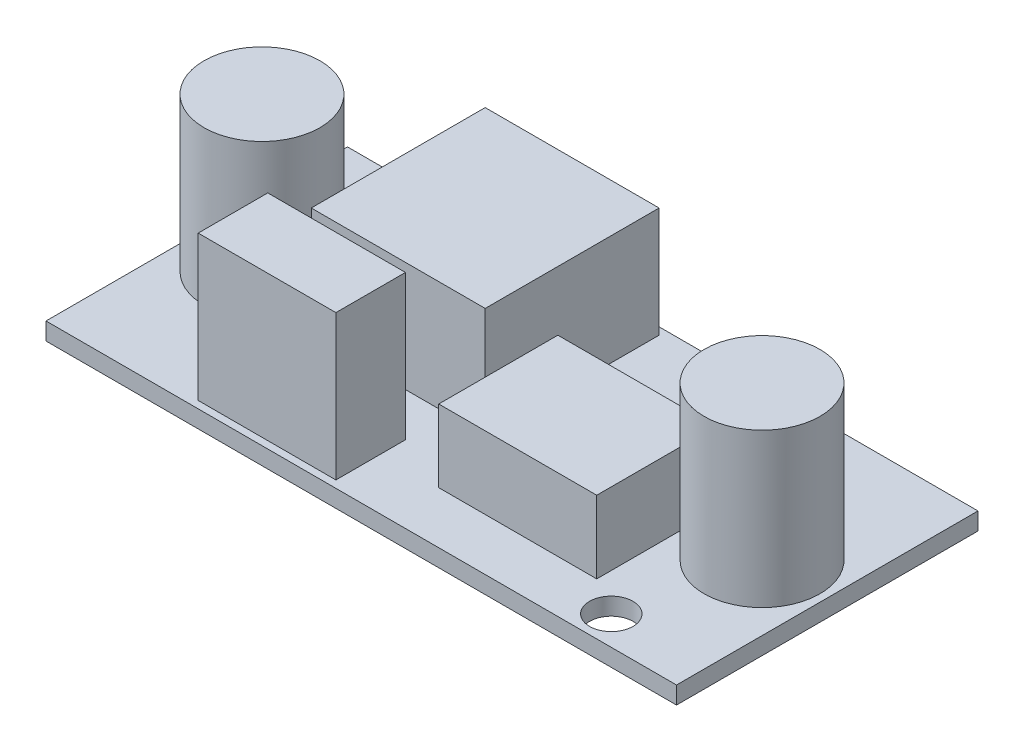
ISO-10303-21;
HEADER;
FILE_DESCRIPTION(('STEP AP214'),'2;1');
FILE_NAME('part.step','',(''),(''),'','','');
FILE_SCHEMA(('AUTOMOTIVE_DESIGN { 1 0 10303 214 1 1 1 1 }'));
ENDSEC;
DATA;
#1=APPLICATION_CONTEXT('core data for automotive mechanical design processes');
#2=APPLICATION_PROTOCOL_DEFINITION('international standard','automotive_design',2000,#1);
#3=PRODUCT_CONTEXT('',#1,'mechanical');
#4=PRODUCT('Part','Part','',(#3));
#5=PRODUCT_RELATED_PRODUCT_CATEGORY('part','',(#4));
#6=PRODUCT_DEFINITION_FORMATION('','',#4);
#7=PRODUCT_DEFINITION_CONTEXT('part definition',#1,'design');
#8=PRODUCT_DEFINITION('design','',#6,#7);
#9=PRODUCT_DEFINITION_SHAPE('','',#8);
#10=(LENGTH_UNIT() NAMED_UNIT(*) SI_UNIT(.MILLI.,.METRE.));
#11=(NAMED_UNIT(*) PLANE_ANGLE_UNIT() SI_UNIT($,.RADIAN.));
#12=(NAMED_UNIT(*) SI_UNIT($,.STERADIAN.) SOLID_ANGLE_UNIT());
#13=UNCERTAINTY_MEASURE_WITH_UNIT(LENGTH_MEASURE(1.E-05),#10,'distance_accuracy_value','');
#14=(GEOMETRIC_REPRESENTATION_CONTEXT(3) GLOBAL_UNCERTAINTY_ASSIGNED_CONTEXT((#13)) GLOBAL_UNIT_ASSIGNED_CONTEXT((#10,
#11,#12)) REPRESENTATION_CONTEXT('',''));
#15=CARTESIAN_POINT('',(0.,0.,0.));
#16=DIRECTION('',(0.,0.,1.));
#17=DIRECTION('',(1.,0.,0.));
#18=AXIS2_PLACEMENT_3D('',#15,#16,#17);
#19=CARTESIAN_POINT('',(0.,1.2,0.));
#20=DIRECTION('',(0.,-1.,0.));
#21=DIRECTION('',(0.,0.,-1.));
#22=AXIS2_PLACEMENT_3D('',#19,#20,#21);
#23=PLANE('',#22);
#24=CARTESIAN_POINT('',(15.25,1.2,8.4));
#25=DIRECTION('',(0.,1.,0.));
#26=DIRECTION('',(0.,0.,1.));
#27=AXIS2_PLACEMENT_3D('',#24,#25,#26);
#28=CIRCLE('',#27,1.5);
#29=CARTESIAN_POINT('',(15.25,1.2,9.9));
#30=VERTEX_POINT('',#29);
#31=EDGE_CURVE('E330',#30,#30,#28,.T.);
#32=ORIENTED_EDGE('',*,*,#31,.F.);
#33=EDGE_LOOP('',(#32));
#34=FACE_BOUND('',#33,.T.);
#35=CARTESIAN_POINT('',(-15.25,1.2,-8.4));
#36=DIRECTION('',(0.,1.,0.));
#37=DIRECTION('',(0.,0.,1.));
#38=AXIS2_PLACEMENT_3D('',#35,#36,#37);
#39=CIRCLE('',#38,1.5);
#40=CARTESIAN_POINT('',(-15.25,1.2,-6.9));
#41=VERTEX_POINT('',#40);
#42=EDGE_CURVE('E337',#41,#41,#39,.T.);
#43=ORIENTED_EDGE('',*,*,#42,.F.);
#44=EDGE_LOOP('',(#43));
#45=FACE_BOUND('',#44,.T.);
#46=DIRECTION('',(0.,0.,1.));
#47=VECTOR('',#46,1.);
#48=CARTESIAN_POINT('',(-11.75,1.2,5.1));
#49=LINE('',#48,#47);
#50=CARTESIAN_POINT('',(-11.75,1.2,5.1));
#51=VERTEX_POINT('',#50);
#52=CARTESIAN_POINT('',(-11.75,1.2,9.9));
#53=VERTEX_POINT('',#52);
#54=EDGE_CURVE('E179',#51,#53,#49,.T.);
#55=ORIENTED_EDGE('',*,*,#54,.F.);
#56=DIRECTION('',(-1.,0.,0.));
#57=VECTOR('',#56,1.);
#58=CARTESIAN_POINT('',(-11.75,1.2,5.1));
#59=LINE('',#58,#57);
#60=CARTESIAN_POINT('',(-2.25,1.2,5.1));
#61=VERTEX_POINT('',#60);
#62=EDGE_CURVE('E195',#61,#51,#59,.T.);
#63=ORIENTED_EDGE('',*,*,#62,.F.);
#64=DIRECTION('',(0.,0.,-1.));
#65=VECTOR('',#64,1.);
#66=CARTESIAN_POINT('',(-2.25,1.2,5.1));
#67=LINE('',#66,#65);
#68=CARTESIAN_POINT('',(-2.25,1.2,9.9));
#69=VERTEX_POINT('',#68);
#70=EDGE_CURVE('E208',#69,#61,#67,.T.);
#71=ORIENTED_EDGE('',*,*,#70,.F.);
#72=DIRECTION('',(1.,0.,0.));
#73=VECTOR('',#72,1.);
#74=CARTESIAN_POINT('',(-11.75,1.2,9.9));
#75=LINE('',#74,#73);
#76=EDGE_CURVE('E184',#53,#69,#75,.T.);
#77=ORIENTED_EDGE('',*,*,#76,.F.);
#78=EDGE_LOOP('',(#55,#63,#71,#77));
#79=FACE_BOUND('',#78,.T.);
#80=CARTESIAN_POINT('',(17.25,1.2,0.));
#81=DIRECTION('',(0.,-1.,0.));
#82=DIRECTION('',(0.,0.,-1.));
#83=AXIS2_PLACEMENT_3D('',#80,#81,#82);
#84=CIRCLE('',#83,4.);
#85=CARTESIAN_POINT('',(17.25,1.2,-4.));
#86=VERTEX_POINT('',#85);
#87=EDGE_CURVE('E11',#86,#86,#84,.F.);
#88=ORIENTED_EDGE('',*,*,#87,.F.);
#89=EDGE_LOOP('',(#88));
#90=FACE_BOUND('',#89,.T.);
#91=CARTESIAN_POINT('',(-17.25,1.2,0.));
#92=DIRECTION('',(0.,-1.,0.));
#93=DIRECTION('',(0.,0.,-1.));
#94=AXIS2_PLACEMENT_3D('',#91,#92,#93);
#95=CIRCLE('',#94,4.);
#96=CARTESIAN_POINT('',(-17.25,1.2,-4.));
#97=VERTEX_POINT('',#96);
#98=EDGE_CURVE('E49',#97,#97,#95,.F.);
#99=ORIENTED_EDGE('',*,*,#98,.F.);
#100=EDGE_LOOP('',(#99));
#101=FACE_BOUND('',#100,.T.);
#102=DIRECTION('',(0.,0.,-1.));
#103=VECTOR('',#102,1.);
#104=CARTESIAN_POINT('',(21.75,1.2,10.4));
#105=LINE('',#104,#103);
#106=CARTESIAN_POINT('',(21.75,1.2,10.4));
#107=VERTEX_POINT('',#106);
#108=CARTESIAN_POINT('',(21.75,1.2,-10.4));
#109=VERTEX_POINT('',#108);
#110=EDGE_CURVE('E284',#107,#109,#105,.T.);
#111=ORIENTED_EDGE('',*,*,#110,.T.);
#112=DIRECTION('',(-1.,0.,0.));
#113=VECTOR('',#112,1.);
#114=CARTESIAN_POINT('',(-21.75,1.2,-10.4));
#115=LINE('',#114,#113);
#116=CARTESIAN_POINT('',(-21.75,1.2,-10.4));
#117=VERTEX_POINT('',#116);
#118=EDGE_CURVE('E288',#109,#117,#115,.T.);
#119=ORIENTED_EDGE('',*,*,#118,.T.);
#120=DIRECTION('',(0.,0.,1.));
#121=VECTOR('',#120,1.);
#122=CARTESIAN_POINT('',(-21.75,1.2,10.4));
#123=LINE('',#122,#121);
#124=CARTESIAN_POINT('',(-21.75,1.2,10.4));
#125=VERTEX_POINT('',#124);
#126=EDGE_CURVE('E292',#117,#125,#123,.T.);
#127=ORIENTED_EDGE('',*,*,#126,.T.);
#128=DIRECTION('',(1.,0.,0.));
#129=VECTOR('',#128,1.);
#130=CARTESIAN_POINT('',(-21.75,1.2,10.4));
#131=LINE('',#130,#129);
#132=EDGE_CURVE('E295',#125,#107,#131,.T.);
#133=ORIENTED_EDGE('',*,*,#132,.T.);
#134=EDGE_LOOP('',(#111,#119,#127,#133));
#135=FACE_BOUND('',#134,.T.);
#136=DIRECTION('',(0.,0.,1.));
#137=VECTOR('',#136,1.);
#138=CARTESIAN_POINT('',(-11.75,1.2,-9.9));
#139=LINE('',#138,#137);
#140=CARTESIAN_POINT('',(-11.75,1.2,-9.9));
#141=VERTEX_POINT('',#140);
#142=CARTESIAN_POINT('',(-11.75,1.2,2.1));
#143=VERTEX_POINT('',#142);
#144=EDGE_CURVE('E238',#141,#143,#139,.T.);
#145=ORIENTED_EDGE('',*,*,#144,.F.);
#146=DIRECTION('',(-1.,0.,0.));
#147=VECTOR('',#146,1.);
#148=CARTESIAN_POINT('',(-11.75,1.2,-9.9));
#149=LINE('',#148,#147);
#150=CARTESIAN_POINT('',(0.249999999999999,1.2,-9.9));
#151=VERTEX_POINT('',#150);
#152=EDGE_CURVE('E244',#151,#141,#149,.T.);
#153=ORIENTED_EDGE('',*,*,#152,.F.);
#154=DIRECTION('',(0.,0.,-1.));
#155=VECTOR('',#154,1.);
#156=CARTESIAN_POINT('',(0.249999999999999,1.2,-9.9));
#157=LINE('',#156,#155);
#158=CARTESIAN_POINT('',(0.25,1.2,2.1));
#159=VERTEX_POINT('',#158);
#160=EDGE_CURVE('E261',#159,#151,#157,.T.);
#161=ORIENTED_EDGE('',*,*,#160,.F.);
#162=DIRECTION('',(1.,0.,0.));
#163=VECTOR('',#162,1.);
#164=CARTESIAN_POINT('',(-11.75,1.2,2.1));
#165=LINE('',#164,#163);
#166=EDGE_CURVE('E257',#143,#159,#165,.T.);
#167=ORIENTED_EDGE('',*,*,#166,.F.);
#168=EDGE_LOOP('',(#145,#153,#161,#167));
#169=FACE_BOUND('',#168,.T.);
#170=DIRECTION('',(0.,0.,1.));
#171=VECTOR('',#170,1.);
#172=CARTESIAN_POINT('',(1.75825449552439,1.2,-1.40660359641949));
#173=LINE('',#172,#171);
#174=CARTESIAN_POINT('',(1.75825449552439,1.2,-1.40660359641949));
#175=VERTEX_POINT('',#174);
#176=CARTESIAN_POINT('',(1.75825449552439,1.2,6.81323617015706));
#177=VERTEX_POINT('',#176);
#178=EDGE_CURVE('E177',#175,#177,#173,.T.);
#179=ORIENTED_EDGE('',*,*,#178,.F.);
#180=DIRECTION('',(-1.,0.,0.));
#181=VECTOR('',#180,1.);
#182=CARTESIAN_POINT('',(1.75825449552439,1.2,-1.40660359641949));
#183=LINE('',#182,#181);
#184=CARTESIAN_POINT('',(12.6594323677757,1.2,-1.40660359641949));
#185=VERTEX_POINT('',#184);
#186=EDGE_CURVE('E174',#185,#175,#183,.T.);
#187=ORIENTED_EDGE('',*,*,#186,.F.);
#188=DIRECTION('',(0.,0.,-1.));
#189=VECTOR('',#188,1.);
#190=CARTESIAN_POINT('',(12.6594323677757,1.2,-1.40660359641949));
#191=LINE('',#190,#189);
#192=CARTESIAN_POINT('',(12.6594323677757,1.2,6.81323617015706));
#193=VERTEX_POINT('',#192);
#194=EDGE_CURVE('E62',#193,#185,#191,.T.);
#195=ORIENTED_EDGE('',*,*,#194,.F.);
#196=DIRECTION('',(1.,0.,0.));
#197=VECTOR('',#196,1.);
#198=CARTESIAN_POINT('',(1.75825449552439,1.2,6.81323617015706));
#199=LINE('',#198,#197);
#200=EDGE_CURVE('E57',#177,#193,#199,.T.);
#201=ORIENTED_EDGE('',*,*,#200,.F.);
#202=EDGE_LOOP('',(#179,#187,#195,#201));
#203=FACE_BOUND('',#202,.T.);
#204=ADVANCED_FACE('F39',(#34,#45,#79,#90,#101,#135,#169,#203),#23,.F.);
#205=CARTESIAN_POINT('',(21.75,1.2,10.4));
#206=DIRECTION('',(-1.,0.,0.));
#207=DIRECTION('',(0.,0.,1.));
#208=AXIS2_PLACEMENT_3D('',#205,#206,#207);
#209=PLANE('',#208);
#210=DIRECTION('',(0.,0.,-1.));
#211=VECTOR('',#210,1.);
#212=CARTESIAN_POINT('',(21.75,0.,10.4));
#213=LINE('',#212,#211);
#214=CARTESIAN_POINT('',(21.75,0.,10.4));
#215=VERTEX_POINT('',#214);
#216=CARTESIAN_POINT('',(21.75,0.,-10.4));
#217=VERTEX_POINT('',#216);
#218=EDGE_CURVE('E283',#215,#217,#213,.T.);
#219=ORIENTED_EDGE('',*,*,#218,.T.);
#220=DIRECTION('',(0.,-1.,0.));
#221=VECTOR('',#220,1.);
#222=CARTESIAN_POINT('',(21.75,1.2,-10.4));
#223=LINE('',#222,#221);
#224=EDGE_CURVE('E321',#109,#217,#223,.T.);
#225=ORIENTED_EDGE('',*,*,#224,.F.);
#226=ORIENTED_EDGE('',*,*,#110,.F.);
#227=DIRECTION('',(0.,-1.,0.));
#228=VECTOR('',#227,1.);
#229=CARTESIAN_POINT('',(21.75,1.2,10.4));
#230=LINE('',#229,#228);
#231=EDGE_CURVE('E298',#107,#215,#230,.T.);
#232=ORIENTED_EDGE('',*,*,#231,.T.);
#233=EDGE_LOOP('',(#219,#225,#226,#232));
#234=FACE_BOUND('',#233,.T.);
#235=ADVANCED_FACE('F41',(#234),#209,.F.);
#236=CARTESIAN_POINT('',(-21.75,1.2,-10.4));
#237=DIRECTION('',(0.,0.,1.));
#238=DIRECTION('',(1.,0.,0.));
#239=AXIS2_PLACEMENT_3D('',#236,#237,#238);
#240=PLANE('',#239);
#241=DIRECTION('',(-1.,0.,0.));
#242=VECTOR('',#241,1.);
#243=CARTESIAN_POINT('',(-21.75,0.,-10.4));
#244=LINE('',#243,#242);
#245=CARTESIAN_POINT('',(-21.75,0.,-10.4));
#246=VERTEX_POINT('',#245);
#247=EDGE_CURVE('E302',#217,#246,#244,.T.);
#248=ORIENTED_EDGE('',*,*,#247,.T.);
#249=DIRECTION('',(0.,-1.,0.));
#250=VECTOR('',#249,1.);
#251=CARTESIAN_POINT('',(-21.75,1.2,-10.4));
#252=LINE('',#251,#250);
#253=EDGE_CURVE('E317',#117,#246,#252,.T.);
#254=ORIENTED_EDGE('',*,*,#253,.F.);
#255=ORIENTED_EDGE('',*,*,#118,.F.);
#256=ORIENTED_EDGE('',*,*,#224,.T.);
#257=EDGE_LOOP('',(#248,#254,#255,#256));
#258=FACE_BOUND('',#257,.T.);
#259=ADVANCED_FACE('F381',(#258),#240,.F.);
#260=CARTESIAN_POINT('',(-21.75,1.2,10.4));
#261=DIRECTION('',(1.,0.,0.));
#262=DIRECTION('',(0.,0.,-1.));
#263=AXIS2_PLACEMENT_3D('',#260,#261,#262);
#264=PLANE('',#263);
#265=DIRECTION('',(0.,0.,1.));
#266=VECTOR('',#265,1.);
#267=CARTESIAN_POINT('',(-21.75,0.,10.4));
#268=LINE('',#267,#266);
#269=CARTESIAN_POINT('',(-21.75,0.,10.4));
#270=VERTEX_POINT('',#269);
#271=EDGE_CURVE('E305',#246,#270,#268,.T.);
#272=ORIENTED_EDGE('',*,*,#271,.T.);
#273=DIRECTION('',(0.,-1.,0.));
#274=VECTOR('',#273,1.);
#275=CARTESIAN_POINT('',(-21.75,1.2,10.4));
#276=LINE('',#275,#274);
#277=EDGE_CURVE('E313',#125,#270,#276,.T.);
#278=ORIENTED_EDGE('',*,*,#277,.F.);
#279=ORIENTED_EDGE('',*,*,#126,.F.);
#280=ORIENTED_EDGE('',*,*,#253,.T.);
#281=EDGE_LOOP('',(#272,#278,#279,#280));
#282=FACE_BOUND('',#281,.T.);
#283=ADVANCED_FACE('F395',(#282),#264,.F.);
#284=CARTESIAN_POINT('',(-21.75,1.2,10.4));
#285=DIRECTION('',(0.,0.,-1.));
#286=DIRECTION('',(-1.,0.,0.));
#287=AXIS2_PLACEMENT_3D('',#284,#285,#286);
#288=PLANE('',#287);
#289=DIRECTION('',(1.,0.,0.));
#290=VECTOR('',#289,1.);
#291=CARTESIAN_POINT('',(-21.75,0.,10.4));
#292=LINE('',#291,#290);
#293=EDGE_CURVE('E289',#270,#215,#292,.T.);
#294=ORIENTED_EDGE('',*,*,#293,.T.);
#295=ORIENTED_EDGE('',*,*,#231,.F.);
#296=ORIENTED_EDGE('',*,*,#132,.F.);
#297=ORIENTED_EDGE('',*,*,#277,.T.);
#298=EDGE_LOOP('',(#294,#295,#296,#297));
#299=FACE_BOUND('',#298,.T.);
#300=ADVANCED_FACE('F391',(#299),#288,.F.);
#301=CARTESIAN_POINT('',(0.,0.,0.));
#302=DIRECTION('',(0.,-1.,0.));
#303=DIRECTION('',(0.,0.,-1.));
#304=AXIS2_PLACEMENT_3D('',#301,#302,#303);
#305=PLANE('',#304);
#306=CARTESIAN_POINT('',(15.25,0.,8.4));
#307=DIRECTION('',(0.,-1.,0.));
#308=DIRECTION('',(0.,0.,-1.));
#309=AXIS2_PLACEMENT_3D('',#306,#307,#308);
#310=CIRCLE('',#309,1.5);
#311=CARTESIAN_POINT('',(15.25,0.,6.9));
#312=VERTEX_POINT('',#311);
#313=EDGE_CURVE('E43',#312,#312,#310,.T.);
#314=ORIENTED_EDGE('',*,*,#313,.F.);
#315=EDGE_LOOP('',(#314));
#316=FACE_BOUND('',#315,.T.);
#317=CARTESIAN_POINT('',(-15.25,0.,-8.4));
#318=DIRECTION('',(0.,-1.,0.));
#319=DIRECTION('',(0.,0.,-1.));
#320=AXIS2_PLACEMENT_3D('',#317,#318,#319);
#321=CIRCLE('',#320,1.5);
#322=CARTESIAN_POINT('',(-15.25,0.,-9.9));
#323=VERTEX_POINT('',#322);
#324=EDGE_CURVE('E327',#323,#323,#321,.T.);
#325=ORIENTED_EDGE('',*,*,#324,.F.);
#326=EDGE_LOOP('',(#325));
#327=FACE_BOUND('',#326,.T.);
#328=ORIENTED_EDGE('',*,*,#218,.F.);
#329=ORIENTED_EDGE('',*,*,#293,.F.);
#330=ORIENTED_EDGE('',*,*,#271,.F.);
#331=ORIENTED_EDGE('',*,*,#247,.F.);
#332=EDGE_LOOP('',(#328,#329,#330,#331));
#333=FACE_BOUND('',#332,.T.);
#334=ADVANCED_FACE('F388',(#316,#327,#333),#305,.T.);
#335=CARTESIAN_POINT('',(-11.75,8.8,-9.9));
#336=DIRECTION('',(1.,0.,0.));
#337=DIRECTION('',(0.,0.,-1.));
#338=AXIS2_PLACEMENT_3D('',#335,#336,#337);
#339=PLANE('',#338);
#340=ORIENTED_EDGE('',*,*,#144,.T.);
#341=DIRECTION('',(0.,-1.,0.));
#342=VECTOR('',#341,1.);
#343=CARTESIAN_POINT('',(-11.75,8.8,2.1));
#344=LINE('',#343,#342);
#345=CARTESIAN_POINT('',(-11.75,8.8,2.1));
#346=VERTEX_POINT('',#345);
#347=EDGE_CURVE('E279',#346,#143,#344,.T.);
#348=ORIENTED_EDGE('',*,*,#347,.F.);
#349=DIRECTION('',(0.,0.,1.));
#350=VECTOR('',#349,1.);
#351=CARTESIAN_POINT('',(-11.75,8.8,-9.9));
#352=LINE('',#351,#350);
#353=CARTESIAN_POINT('',(-11.75,8.8,-9.9));
#354=VERTEX_POINT('',#353);
#355=EDGE_CURVE('E239',#354,#346,#352,.T.);
#356=ORIENTED_EDGE('',*,*,#355,.F.);
#357=DIRECTION('',(0.,-1.,0.));
#358=VECTOR('',#357,1.);
#359=CARTESIAN_POINT('',(-11.75,8.8,-9.9));
#360=LINE('',#359,#358);
#361=EDGE_CURVE('E253',#354,#141,#360,.T.);
#362=ORIENTED_EDGE('',*,*,#361,.T.);
#363=EDGE_LOOP('',(#340,#348,#356,#362));
#364=FACE_BOUND('',#363,.T.);
#365=ADVANCED_FACE('F386',(#364),#339,.F.);
#366=CARTESIAN_POINT('',(-11.75,8.8,2.1));
#367=DIRECTION('',(0.,0.,-1.));
#368=DIRECTION('',(-1.,0.,0.));
#369=AXIS2_PLACEMENT_3D('',#366,#367,#368);
#370=PLANE('',#369);
#371=ORIENTED_EDGE('',*,*,#166,.T.);
#372=DIRECTION('',(0.,-1.,0.));
#373=VECTOR('',#372,1.);
#374=CARTESIAN_POINT('',(0.25,8.8,2.1));
#375=LINE('',#374,#373);
#376=CARTESIAN_POINT('',(0.25,8.8,2.1));
#377=VERTEX_POINT('',#376);
#378=EDGE_CURVE('E275',#377,#159,#375,.T.);
#379=ORIENTED_EDGE('',*,*,#378,.F.);
#380=DIRECTION('',(1.,0.,0.));
#381=VECTOR('',#380,1.);
#382=CARTESIAN_POINT('',(-11.75,8.8,2.1));
#383=LINE('',#382,#381);
#384=EDGE_CURVE('E243',#346,#377,#383,.T.);
#385=ORIENTED_EDGE('',*,*,#384,.F.);
#386=ORIENTED_EDGE('',*,*,#347,.T.);
#387=EDGE_LOOP('',(#371,#379,#385,#386));
#388=FACE_BOUND('',#387,.T.);
#389=ADVANCED_FACE('F431',(#388),#370,.F.);
#390=CARTESIAN_POINT('',(0.249999999999999,8.8,-9.9));
#391=DIRECTION('',(-1.,0.,0.));
#392=DIRECTION('',(0.,0.,1.));
#393=AXIS2_PLACEMENT_3D('',#390,#391,#392);
#394=PLANE('',#393);
#395=ORIENTED_EDGE('',*,*,#160,.T.);
#396=DIRECTION('',(0.,-1.,0.));
#397=VECTOR('',#396,1.);
#398=CARTESIAN_POINT('',(0.249999999999999,8.8,-9.9));
#399=LINE('',#398,#397);
#400=CARTESIAN_POINT('',(0.249999999999999,8.8,-9.9));
#401=VERTEX_POINT('',#400);
#402=EDGE_CURVE('E271',#401,#151,#399,.T.);
#403=ORIENTED_EDGE('',*,*,#402,.F.);
#404=DIRECTION('',(0.,0.,-1.));
#405=VECTOR('',#404,1.);
#406=CARTESIAN_POINT('',(0.249999999999999,8.8,-9.9));
#407=LINE('',#406,#405);
#408=EDGE_CURVE('E247',#377,#401,#407,.T.);
#409=ORIENTED_EDGE('',*,*,#408,.F.);
#410=ORIENTED_EDGE('',*,*,#378,.T.);
#411=EDGE_LOOP('',(#395,#403,#409,#410));
#412=FACE_BOUND('',#411,.T.);
#413=ADVANCED_FACE('F429',(#412),#394,.F.);
#414=CARTESIAN_POINT('',(-11.75,8.8,-9.9));
#415=DIRECTION('',(0.,0.,1.));
#416=DIRECTION('',(1.,0.,0.));
#417=AXIS2_PLACEMENT_3D('',#414,#415,#416);
#418=PLANE('',#417);
#419=ORIENTED_EDGE('',*,*,#152,.T.);
#420=ORIENTED_EDGE('',*,*,#361,.F.);
#421=DIRECTION('',(-1.,0.,0.));
#422=VECTOR('',#421,1.);
#423=CARTESIAN_POINT('',(-11.75,8.8,-9.9));
#424=LINE('',#423,#422);
#425=EDGE_CURVE('E250',#401,#354,#424,.T.);
#426=ORIENTED_EDGE('',*,*,#425,.F.);
#427=ORIENTED_EDGE('',*,*,#402,.T.);
#428=EDGE_LOOP('',(#419,#420,#426,#427));
#429=FACE_BOUND('',#428,.T.);
#430=ADVANCED_FACE('F420',(#429),#418,.F.);
#431=CARTESIAN_POINT('',(0.,8.8,0.));
#432=DIRECTION('',(0.,1.,0.));
#433=DIRECTION('',(0.,0.,1.));
#434=AXIS2_PLACEMENT_3D('',#431,#432,#433);
#435=PLANE('',#434);
#436=ORIENTED_EDGE('',*,*,#355,.T.);
#437=ORIENTED_EDGE('',*,*,#384,.T.);
#438=ORIENTED_EDGE('',*,*,#408,.T.);
#439=ORIENTED_EDGE('',*,*,#425,.T.);
#440=EDGE_LOOP('',(#436,#437,#438,#439));
#441=FACE_BOUND('',#440,.T.);
#442=ADVANCED_FACE('F425',(#441),#435,.T.);
#443=CARTESIAN_POINT('',(-17.25,11.8,0.));
#444=DIRECTION('',(0.,-1.,0.));
#445=DIRECTION('',(0.,0.,-1.));
#446=AXIS2_PLACEMENT_3D('',#443,#444,#445);
#447=CYLINDRICAL_SURFACE('',#446,4.);
#448=CARTESIAN_POINT('',(-17.25,11.8,0.));
#449=DIRECTION('',(0.,1.,0.));
#450=DIRECTION('',(0.,0.,1.));
#451=AXIS2_PLACEMENT_3D('',#448,#449,#450);
#452=CIRCLE('',#451,4.);
#453=CARTESIAN_POINT('',(-17.25,11.8,4.));
#454=VERTEX_POINT('',#453);
#455=EDGE_CURVE('E234',#454,#454,#452,.T.);
#456=ORIENTED_EDGE('',*,*,#455,.F.);
#457=EDGE_LOOP('',(#456));
#458=FACE_BOUND('',#457,.T.);
#459=ORIENTED_EDGE('',*,*,#98,.T.);
#460=EDGE_LOOP('',(#459));
#461=FACE_BOUND('',#460,.T.);
#462=ADVANCED_FACE('F443',(#458,#461),#447,.T.);
#463=CARTESIAN_POINT('',(-17.25,11.8,0.));
#464=DIRECTION('',(0.,1.,0.));
#465=DIRECTION('',(0.,0.,1.));
#466=AXIS2_PLACEMENT_3D('',#463,#464,#465);
#467=PLANE('',#466);
#468=ORIENTED_EDGE('',*,*,#455,.T.);
#469=EDGE_LOOP('',(#468));
#470=FACE_BOUND('',#469,.T.);
#471=ADVANCED_FACE('F446',(#470),#467,.T.);
#472=CARTESIAN_POINT('',(17.25,11.8,0.));
#473=DIRECTION('',(0.,-1.,0.));
#474=DIRECTION('',(0.,0.,-1.));
#475=AXIS2_PLACEMENT_3D('',#472,#473,#474);
#476=CYLINDRICAL_SURFACE('',#475,4.);
#477=CARTESIAN_POINT('',(17.25,11.8,0.));
#478=DIRECTION('',(0.,1.,0.));
#479=DIRECTION('',(0.,0.,1.));
#480=AXIS2_PLACEMENT_3D('',#477,#478,#479);
#481=CIRCLE('',#480,4.);
#482=CARTESIAN_POINT('',(17.25,11.8,4.));
#483=VERTEX_POINT('',#482);
#484=EDGE_CURVE('E230',#483,#483,#481,.T.);
#485=ORIENTED_EDGE('',*,*,#484,.F.);
#486=EDGE_LOOP('',(#485));
#487=FACE_BOUND('',#486,.T.);
#488=ORIENTED_EDGE('',*,*,#87,.T.);
#489=EDGE_LOOP('',(#488));
#490=FACE_BOUND('',#489,.T.);
#491=ADVANCED_FACE('F450',(#487,#490),#476,.T.);
#492=CARTESIAN_POINT('',(17.25,11.8,0.));
#493=DIRECTION('',(0.,1.,0.));
#494=DIRECTION('',(0.,0.,1.));
#495=AXIS2_PLACEMENT_3D('',#492,#493,#494);
#496=PLANE('',#495);
#497=ORIENTED_EDGE('',*,*,#484,.T.);
#498=EDGE_LOOP('',(#497));
#499=FACE_BOUND('',#498,.T.);
#500=ADVANCED_FACE('F454',(#499),#496,.T.);
#501=CARTESIAN_POINT('',(-11.75,11.2,5.1));
#502=DIRECTION('',(1.,0.,0.));
#503=DIRECTION('',(0.,0.,-1.));
#504=AXIS2_PLACEMENT_3D('',#501,#502,#503);
#505=PLANE('',#504);
#506=ORIENTED_EDGE('',*,*,#54,.T.);
#507=DIRECTION('',(0.,-1.,0.));
#508=VECTOR('',#507,1.);
#509=CARTESIAN_POINT('',(-11.75,11.2,9.9));
#510=LINE('',#509,#508);
#511=CARTESIAN_POINT('',(-11.75,11.2,9.9));
#512=VERTEX_POINT('',#511);
#513=EDGE_CURVE('E226',#512,#53,#510,.T.);
#514=ORIENTED_EDGE('',*,*,#513,.F.);
#515=DIRECTION('',(0.,0.,1.));
#516=VECTOR('',#515,1.);
#517=CARTESIAN_POINT('',(-11.75,11.2,5.1));
#518=LINE('',#517,#516);
#519=CARTESIAN_POINT('',(-11.75,11.2,5.1));
#520=VERTEX_POINT('',#519);
#521=EDGE_CURVE('E190',#520,#512,#518,.T.);
#522=ORIENTED_EDGE('',*,*,#521,.F.);
#523=DIRECTION('',(0.,-1.,0.));
#524=VECTOR('',#523,1.);
#525=CARTESIAN_POINT('',(-11.75,11.2,5.1));
#526=LINE('',#525,#524);
#527=EDGE_CURVE('E203',#520,#51,#526,.T.);
#528=ORIENTED_EDGE('',*,*,#527,.T.);
#529=EDGE_LOOP('',(#506,#514,#522,#528));
#530=FACE_BOUND('',#529,.T.);
#531=ADVANCED_FACE('F458',(#530),#505,.F.);
#532=CARTESIAN_POINT('',(-11.75,11.2,9.9));
#533=DIRECTION('',(0.,0.,-1.));
#534=DIRECTION('',(-1.,0.,0.));
#535=AXIS2_PLACEMENT_3D('',#532,#533,#534);
#536=PLANE('',#535);
#537=ORIENTED_EDGE('',*,*,#76,.T.);
#538=DIRECTION('',(0.,-1.,0.));
#539=VECTOR('',#538,1.);
#540=CARTESIAN_POINT('',(-2.25,11.2,9.9));
#541=LINE('',#540,#539);
#542=CARTESIAN_POINT('',(-2.25,11.2,9.9));
#543=VERTEX_POINT('',#542);
#544=EDGE_CURVE('E222',#543,#69,#541,.T.);
#545=ORIENTED_EDGE('',*,*,#544,.F.);
#546=DIRECTION('',(1.,0.,0.));
#547=VECTOR('',#546,1.);
#548=CARTESIAN_POINT('',(-11.75,11.2,9.9));
#549=LINE('',#548,#547);
#550=EDGE_CURVE('E194',#512,#543,#549,.T.);
#551=ORIENTED_EDGE('',*,*,#550,.F.);
#552=ORIENTED_EDGE('',*,*,#513,.T.);
#553=EDGE_LOOP('',(#537,#545,#551,#552));
#554=FACE_BOUND('',#553,.T.);
#555=ADVANCED_FACE('F462',(#554),#536,.F.);
#556=CARTESIAN_POINT('',(-2.25,11.2,5.1));
#557=DIRECTION('',(-1.,0.,0.));
#558=DIRECTION('',(0.,0.,1.));
#559=AXIS2_PLACEMENT_3D('',#556,#557,#558);
#560=PLANE('',#559);
#561=ORIENTED_EDGE('',*,*,#70,.T.);
#562=DIRECTION('',(0.,-1.,0.));
#563=VECTOR('',#562,1.);
#564=CARTESIAN_POINT('',(-2.25,11.2,5.1));
#565=LINE('',#564,#563);
#566=CARTESIAN_POINT('',(-2.25,11.2,5.1));
#567=VERTEX_POINT('',#566);
#568=EDGE_CURVE('E218',#567,#61,#565,.T.);
#569=ORIENTED_EDGE('',*,*,#568,.F.);
#570=DIRECTION('',(0.,0.,-1.));
#571=VECTOR('',#570,1.);
#572=CARTESIAN_POINT('',(-2.25,11.2,5.1));
#573=LINE('',#572,#571);
#574=EDGE_CURVE('E198',#543,#567,#573,.T.);
#575=ORIENTED_EDGE('',*,*,#574,.F.);
#576=ORIENTED_EDGE('',*,*,#544,.T.);
#577=EDGE_LOOP('',(#561,#569,#575,#576));
#578=FACE_BOUND('',#577,.T.);
#579=ADVANCED_FACE('F466',(#578),#560,.F.);
#580=CARTESIAN_POINT('',(-11.75,11.2,5.1));
#581=DIRECTION('',(0.,0.,1.));
#582=DIRECTION('',(1.,0.,0.));
#583=AXIS2_PLACEMENT_3D('',#580,#581,#582);
#584=PLANE('',#583);
#585=ORIENTED_EDGE('',*,*,#62,.T.);
#586=ORIENTED_EDGE('',*,*,#527,.F.);
#587=DIRECTION('',(-1.,0.,0.));
#588=VECTOR('',#587,1.);
#589=CARTESIAN_POINT('',(-11.75,11.2,5.1));
#590=LINE('',#589,#588);
#591=EDGE_CURVE('E201',#567,#520,#590,.T.);
#592=ORIENTED_EDGE('',*,*,#591,.F.);
#593=ORIENTED_EDGE('',*,*,#568,.T.);
#594=EDGE_LOOP('',(#585,#586,#592,#593));
#595=FACE_BOUND('',#594,.T.);
#596=ADVANCED_FACE('F470',(#595),#584,.F.);
#597=CARTESIAN_POINT('',(0.,11.2,0.));
#598=DIRECTION('',(0.,1.,0.));
#599=DIRECTION('',(0.,0.,1.));
#600=AXIS2_PLACEMENT_3D('',#597,#598,#599);
#601=PLANE('',#600);
#602=ORIENTED_EDGE('',*,*,#521,.T.);
#603=ORIENTED_EDGE('',*,*,#550,.T.);
#604=ORIENTED_EDGE('',*,*,#574,.T.);
#605=ORIENTED_EDGE('',*,*,#591,.T.);
#606=EDGE_LOOP('',(#602,#603,#604,#605));
#607=FACE_BOUND('',#606,.T.);
#608=ADVANCED_FACE('F474',(#607),#601,.T.);
#609=CARTESIAN_POINT('',(1.75825449552439,6.2,-1.40660359641949));
#610=DIRECTION('',(1.,0.,0.));
#611=DIRECTION('',(0.,0.,-1.));
#612=AXIS2_PLACEMENT_3D('',#609,#610,#611);
#613=PLANE('',#612);
#614=ORIENTED_EDGE('',*,*,#178,.T.);
#615=DIRECTION('',(0.,-1.,0.));
#616=VECTOR('',#615,1.);
#617=CARTESIAN_POINT('',(1.75825449552439,6.2,6.81323617015706));
#618=LINE('',#617,#616);
#619=CARTESIAN_POINT('',(1.75825449552439,6.2,6.81323617015706));
#620=VERTEX_POINT('',#619);
#621=EDGE_CURVE('E156',#620,#177,#618,.T.);
#622=ORIENTED_EDGE('',*,*,#621,.F.);
#623=DIRECTION('',(0.,0.,1.));
#624=VECTOR('',#623,1.);
#625=CARTESIAN_POINT('',(1.75825449552439,6.2,-1.40660359641949));
#626=LINE('',#625,#624);
#627=CARTESIAN_POINT('',(1.75825449552439,6.2,-1.40660359641949));
#628=VERTEX_POINT('',#627);
#629=EDGE_CURVE('E164',#628,#620,#626,.T.);
#630=ORIENTED_EDGE('',*,*,#629,.F.);
#631=DIRECTION('',(0.,-1.,0.));
#632=VECTOR('',#631,1.);
#633=CARTESIAN_POINT('',(1.75825449552439,6.2,-1.40660359641949));
#634=LINE('',#633,#632);
#635=EDGE_CURVE('E349',#628,#175,#634,.T.);
#636=ORIENTED_EDGE('',*,*,#635,.T.);
#637=EDGE_LOOP('',(#614,#622,#630,#636));
#638=FACE_BOUND('',#637,.T.);
#639=ADVANCED_FACE('F176',(#638),#613,.F.);
#640=CARTESIAN_POINT('',(1.75825449552439,6.2,6.81323617015706));
#641=DIRECTION('',(0.,0.,-1.));
#642=DIRECTION('',(-1.,0.,0.));
#643=AXIS2_PLACEMENT_3D('',#640,#641,#642);
#644=PLANE('',#643);
#645=ORIENTED_EDGE('',*,*,#200,.T.);
#646=DIRECTION('',(0.,-1.,0.));
#647=VECTOR('',#646,1.);
#648=CARTESIAN_POINT('',(12.6594323677757,6.2,6.81323617015706));
#649=LINE('',#648,#647);
#650=CARTESIAN_POINT('',(12.6594323677757,6.2,6.81323617015706));
#651=VERTEX_POINT('',#650);
#652=EDGE_CURVE('E159',#651,#193,#649,.T.);
#653=ORIENTED_EDGE('',*,*,#652,.F.);
#654=DIRECTION('',(1.,0.,0.));
#655=VECTOR('',#654,1.);
#656=CARTESIAN_POINT('',(1.75825449552439,6.2,6.81323617015706));
#657=LINE('',#656,#655);
#658=EDGE_CURVE('E152',#620,#651,#657,.T.);
#659=ORIENTED_EDGE('',*,*,#658,.F.);
#660=ORIENTED_EDGE('',*,*,#621,.T.);
#661=EDGE_LOOP('',(#645,#653,#659,#660));
#662=FACE_BOUND('',#661,.T.);
#663=ADVANCED_FACE('F154',(#662),#644,.F.);
#664=CARTESIAN_POINT('',(12.6594323677757,6.2,-1.40660359641949));
#665=DIRECTION('',(-1.,0.,0.));
#666=DIRECTION('',(0.,0.,1.));
#667=AXIS2_PLACEMENT_3D('',#664,#665,#666);
#668=PLANE('',#667);
#669=ORIENTED_EDGE('',*,*,#194,.T.);
#670=DIRECTION('',(0.,-1.,0.));
#671=VECTOR('',#670,1.);
#672=CARTESIAN_POINT('',(12.6594323677757,6.2,-1.40660359641949));
#673=LINE('',#672,#671);
#674=CARTESIAN_POINT('',(12.6594323677757,6.2,-1.40660359641949));
#675=VERTEX_POINT('',#674);
#676=EDGE_CURVE('E186',#675,#185,#673,.T.);
#677=ORIENTED_EDGE('',*,*,#676,.F.);
#678=DIRECTION('',(0.,0.,-1.));
#679=VECTOR('',#678,1.);
#680=CARTESIAN_POINT('',(12.6594323677757,6.2,-1.40660359641949));
#681=LINE('',#680,#679);
#682=EDGE_CURVE('E163',#651,#675,#681,.T.);
#683=ORIENTED_EDGE('',*,*,#682,.F.);
#684=ORIENTED_EDGE('',*,*,#652,.T.);
#685=EDGE_LOOP('',(#669,#677,#683,#684));
#686=FACE_BOUND('',#685,.T.);
#687=ADVANCED_FACE('F366',(#686),#668,.F.);
#688=CARTESIAN_POINT('',(1.75825449552439,6.2,-1.40660359641949));
#689=DIRECTION('',(0.,0.,1.));
#690=DIRECTION('',(1.,0.,0.));
#691=AXIS2_PLACEMENT_3D('',#688,#689,#690);
#692=PLANE('',#691);
#693=ORIENTED_EDGE('',*,*,#186,.T.);
#694=ORIENTED_EDGE('',*,*,#635,.F.);
#695=DIRECTION('',(-1.,0.,0.));
#696=VECTOR('',#695,1.);
#697=CARTESIAN_POINT('',(1.75825449552439,6.2,-1.40660359641949));
#698=LINE('',#697,#696);
#699=EDGE_CURVE('E169',#675,#628,#698,.T.);
#700=ORIENTED_EDGE('',*,*,#699,.F.);
#701=ORIENTED_EDGE('',*,*,#676,.T.);
#702=EDGE_LOOP('',(#693,#694,#700,#701));
#703=FACE_BOUND('',#702,.T.);
#704=ADVANCED_FACE('F364',(#703),#692,.F.);
#705=CARTESIAN_POINT('',(0.,6.2,0.));
#706=DIRECTION('',(0.,1.,0.));
#707=DIRECTION('',(0.,0.,1.));
#708=AXIS2_PLACEMENT_3D('',#705,#706,#707);
#709=PLANE('',#708);
#710=ORIENTED_EDGE('',*,*,#629,.T.);
#711=ORIENTED_EDGE('',*,*,#658,.T.);
#712=ORIENTED_EDGE('',*,*,#682,.T.);
#713=ORIENTED_EDGE('',*,*,#699,.T.);
#714=EDGE_LOOP('',(#710,#711,#712,#713));
#715=FACE_BOUND('',#714,.T.);
#716=ADVANCED_FACE('F167',(#715),#709,.T.);
#717=CARTESIAN_POINT('',(-15.25,-3.8,-8.4));
#718=DIRECTION('',(0.,1.,0.));
#719=DIRECTION('',(0.,0.,1.));
#720=AXIS2_PLACEMENT_3D('',#717,#718,#719);
#721=CYLINDRICAL_SURFACE('',#720,1.5);
#722=ORIENTED_EDGE('',*,*,#324,.T.);
#723=EDGE_LOOP('',(#722));
#724=FACE_BOUND('',#723,.T.);
#725=ORIENTED_EDGE('',*,*,#42,.T.);
#726=EDGE_LOOP('',(#725));
#727=FACE_BOUND('',#726,.T.);
#728=ADVANCED_FACE('F506',(#724,#727),#721,.F.);
#729=CARTESIAN_POINT('',(15.25,-3.8,8.4));
#730=DIRECTION('',(0.,1.,0.));
#731=DIRECTION('',(0.,0.,1.));
#732=AXIS2_PLACEMENT_3D('',#729,#730,#731);
#733=CYLINDRICAL_SURFACE('',#732,1.5);
#734=ORIENTED_EDGE('',*,*,#313,.T.);
#735=EDGE_LOOP('',(#734));
#736=FACE_BOUND('',#735,.T.);
#737=ORIENTED_EDGE('',*,*,#31,.T.);
#738=EDGE_LOOP('',(#737));
#739=FACE_BOUND('',#738,.T.);
#740=ADVANCED_FACE('F529',(#736,#739),#733,.F.);
#741=CLOSED_SHELL('',(#204,#235,#259,#283,#300,#334,#365,#389,#413,#430,#442,#462,#471,#491,
#500,#531,#555,#579,#596,#608,#639,#663,#687,#704,#716,#728,#740));
#742=MANIFOLD_SOLID_BREP('B2',#741);
#743=ADVANCED_BREP_SHAPE_REPRESENTATION('',(#18,#742),#14);
#744=SHAPE_DEFINITION_REPRESENTATION(#9,#743);
ENDSEC;
END-ISO-10303-21;
